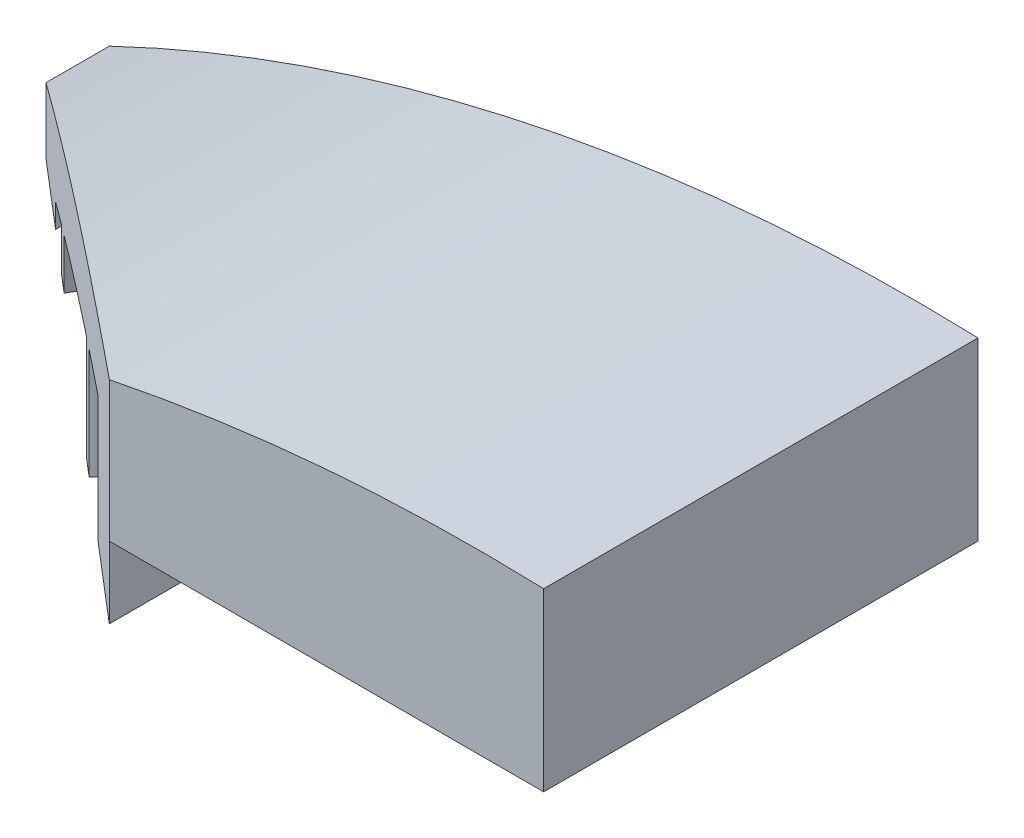
ISO-10303-21;
HEADER;
FILE_DESCRIPTION(('STEP AP214'),'2;1');
FILE_NAME('part.step','',(''),(''),'','','');
FILE_SCHEMA(('AUTOMOTIVE_DESIGN { 1 0 10303 214 1 1 1 1 }'));
ENDSEC;
DATA;
#1=APPLICATION_CONTEXT('core data for automotive mechanical design processes');
#2=APPLICATION_PROTOCOL_DEFINITION('international standard','automotive_design',2000,#1);
#3=PRODUCT_CONTEXT('',#1,'mechanical');
#4=PRODUCT('Part','Part','',(#3));
#5=PRODUCT_RELATED_PRODUCT_CATEGORY('part','',(#4));
#6=PRODUCT_DEFINITION_FORMATION('','',#4);
#7=PRODUCT_DEFINITION_CONTEXT('part definition',#1,'design');
#8=PRODUCT_DEFINITION('design','',#6,#7);
#9=PRODUCT_DEFINITION_SHAPE('','',#8);
#10=(LENGTH_UNIT() NAMED_UNIT(*) SI_UNIT(.MILLI.,.METRE.));
#11=(NAMED_UNIT(*) PLANE_ANGLE_UNIT() SI_UNIT($,.RADIAN.));
#12=(NAMED_UNIT(*) SI_UNIT($,.STERADIAN.) SOLID_ANGLE_UNIT());
#13=UNCERTAINTY_MEASURE_WITH_UNIT(LENGTH_MEASURE(1.E-05),#10,'distance_accuracy_value','');
#14=(GEOMETRIC_REPRESENTATION_CONTEXT(3) GLOBAL_UNCERTAINTY_ASSIGNED_CONTEXT((#13)) GLOBAL_UNIT_ASSIGNED_CONTEXT((#10,
#11,#12)) REPRESENTATION_CONTEXT('',''));
#15=CARTESIAN_POINT('',(0.,0.,0.));
#16=DIRECTION('',(0.,0.,1.));
#17=DIRECTION('',(1.,0.,0.));
#18=AXIS2_PLACEMENT_3D('',#15,#16,#17);
#19=CARTESIAN_POINT('',(-7.9,1.03720809548521,3.95));
#20=DIRECTION('',(0.,1.,0.));
#21=DIRECTION('',(0.,0.,1.));
#22=AXIS2_PLACEMENT_3D('',#19,#20,#21);
#23=PLANE('',#22);
#24=DIRECTION('',(0.,0.,-1.));
#25=VECTOR('',#24,1.);
#26=CARTESIAN_POINT('',(0.,1.03720809548521,3.95));
#27=LINE('',#26,#25);
#28=CARTESIAN_POINT('',(0.,1.03720809548521,3.95));
#29=VERTEX_POINT('',#28);
#30=CARTESIAN_POINT('',(0.,1.03720809548521,-3.95));
#31=VERTEX_POINT('',#30);
#32=EDGE_CURVE('E260',#29,#31,#27,.T.);
#33=ORIENTED_EDGE('',*,*,#32,.F.);
#34=DIRECTION('',(-0.760337182849053,0.,-0.649528573949727));
#35=VECTOR('',#34,1.);
#36=CARTESIAN_POINT('',(-4.5670897898204,1.03720809548521,0.0485002638345054));
#37=LINE('',#36,#35);
#38=CARTESIAN_POINT('',(-1.40471821566003,1.03720809548521,2.75));
#39=VERTEX_POINT('',#38);
#40=EDGE_CURVE('E224',#29,#39,#37,.T.);
#41=ORIENTED_EDGE('',*,*,#40,.T.);
#42=DIRECTION('',(1.,0.,0.));
#43=VECTOR('',#42,1.);
#44=CARTESIAN_POINT('',(6.73873493519161,1.03720809548521,2.75));
#45=LINE('',#44,#43);
#46=CARTESIAN_POINT('',(-1.2,1.03720809548521,2.75));
#47=VERTEX_POINT('',#46);
#48=EDGE_CURVE('E314',#39,#47,#45,.T.);
#49=ORIENTED_EDGE('',*,*,#48,.T.);
#50=DIRECTION('',(0.,0.,-1.));
#51=VECTOR('',#50,1.);
#52=CARTESIAN_POINT('',(-1.2,1.03720809548521,3.95));
#53=LINE('',#52,#51);
#54=CARTESIAN_POINT('',(-1.2,1.03720809548521,-2.75));
#55=VERTEX_POINT('',#54);
#56=EDGE_CURVE('E309',#47,#55,#53,.T.);
#57=ORIENTED_EDGE('',*,*,#56,.T.);
#58=DIRECTION('',(1.,0.,0.));
#59=VECTOR('',#58,1.);
#60=CARTESIAN_POINT('',(6.73873493519161,1.03720809548521,-2.75));
#61=LINE('',#60,#59);
#62=CARTESIAN_POINT('',(-6.7,1.03720809548521,-2.75));
#63=VERTEX_POINT('',#62);
#64=EDGE_CURVE('E306',#63,#55,#61,.T.);
#65=ORIENTED_EDGE('',*,*,#64,.F.);
#66=DIRECTION('',(0.,0.,-1.));
#67=VECTOR('',#66,1.);
#68=CARTESIAN_POINT('',(-6.7,1.03720809548521,3.95));
#69=LINE('',#68,#67);
#70=CARTESIAN_POINT('',(-6.7,1.03720809548521,-1.77356783756967));
#71=VERTEX_POINT('',#70);
#72=EDGE_CURVE('E330',#71,#63,#69,.T.);
#73=ORIENTED_EDGE('',*,*,#72,.F.);
#74=CARTESIAN_POINT('',(-7.9,1.03720809548521,-2.79868446519408));
#75=VERTEX_POINT('',#74);
#76=EDGE_CURVE('E374',#71,#75,#37,.T.);
#77=ORIENTED_EDGE('',*,*,#76,.T.);
#78=DIRECTION('',(0.,0.,-1.));
#79=VECTOR('',#78,1.);
#80=CARTESIAN_POINT('',(-7.9,1.03720809548521,3.95));
#81=LINE('',#80,#79);
#82=CARTESIAN_POINT('',(-7.9,1.03720809548521,-3.95));
#83=VERTEX_POINT('',#82);
#84=EDGE_CURVE('E263',#75,#83,#81,.T.);
#85=ORIENTED_EDGE('',*,*,#84,.T.);
#86=DIRECTION('',(1.,0.,0.));
#87=VECTOR('',#86,1.);
#88=CARTESIAN_POINT('',(-7.9,1.03720809548521,-3.95));
#89=LINE('',#88,#87);
#90=EDGE_CURVE('E240',#83,#31,#89,.T.);
#91=ORIENTED_EDGE('',*,*,#90,.T.);
#92=EDGE_LOOP('',(#33,#41,#49,#57,#65,#73,#77,#85,#91));
#93=FACE_BOUND('',#92,.T.);
#94=ADVANCED_FACE('F53',(#93),#23,.F.);
#95=CARTESIAN_POINT('',(-7.9,1.03720809548521,3.95));
#96=DIRECTION('',(1.,0.,0.));
#97=DIRECTION('',(0.,0.,-1.));
#98=AXIS2_PLACEMENT_3D('',#95,#96,#97);
#99=PLANE('',#98);
#100=ORIENTED_EDGE('',*,*,#84,.F.);
#101=DIRECTION('',(0.,-1.,0.));
#102=VECTOR('',#101,1.);
#103=CARTESIAN_POINT('',(-7.9,5.56078833662162,-2.79868446519408));
#104=LINE('',#103,#102);
#105=CARTESIAN_POINT('',(-7.9,2.23720809548521,-2.79868446519408));
#106=VERTEX_POINT('',#105);
#107=EDGE_CURVE('E213',#106,#75,#104,.T.);
#108=ORIENTED_EDGE('',*,*,#107,.F.);
#109=DIRECTION('',(0.,0.,-1.));
#110=VECTOR('',#109,1.);
#111=CARTESIAN_POINT('',(-7.9,2.23720809548521,3.95));
#112=LINE('',#111,#110);
#113=CARTESIAN_POINT('',(-7.9,2.23720809548521,-3.95));
#114=VERTEX_POINT('',#113);
#115=EDGE_CURVE('E222',#106,#114,#112,.T.);
#116=ORIENTED_EDGE('',*,*,#115,.T.);
#117=DIRECTION('',(0.,-1.,0.));
#118=VECTOR('',#117,1.);
#119=CARTESIAN_POINT('',(-7.9,1.03720809548521,-3.95));
#120=LINE('',#119,#118);
#121=EDGE_CURVE('E237',#114,#83,#120,.T.);
#122=ORIENTED_EDGE('',*,*,#121,.T.);
#123=EDGE_LOOP('',(#100,#108,#116,#122));
#124=FACE_BOUND('',#123,.T.);
#125=ADVANCED_FACE('F55',(#124),#99,.F.);
#126=CARTESIAN_POINT('',(0.,1.03720809548521,3.95));
#127=DIRECTION('',(-1.,0.,0.));
#128=DIRECTION('',(0.,0.,1.));
#129=AXIS2_PLACEMENT_3D('',#126,#127,#128);
#130=PLANE('',#129);
#131=DIRECTION('',(0.,1.,0.));
#132=VECTOR('',#131,1.);
#133=CARTESIAN_POINT('',(0.,1.03720809548521,-3.95));
#134=LINE('',#133,#132);
#135=CARTESIAN_POINT('',(0.,2.34089257913856,-3.95));
#136=VERTEX_POINT('',#135);
#137=EDGE_CURVE('E243',#31,#136,#134,.T.);
#138=ORIENTED_EDGE('',*,*,#137,.T.);
#139=DIRECTION('',(0.,0.,-1.));
#140=VECTOR('',#139,1.);
#141=CARTESIAN_POINT('',(0.,2.34089257913856,3.95));
#142=LINE('',#141,#140);
#143=CARTESIAN_POINT('',(0.,2.34089257913856,-2.76982131033317));
#144=VERTEX_POINT('',#143);
#145=EDGE_CURVE('E256',#144,#136,#142,.T.);
#146=ORIENTED_EDGE('',*,*,#145,.F.);
#147=DIRECTION('',(0.,-1.,0.));
#148=VECTOR('',#147,1.);
#149=CARTESIAN_POINT('',(0.,4.74089257913856,-2.76982131033317));
#150=LINE('',#149,#148);
#151=CARTESIAN_POINT('',(0.,4.74089257913856,-2.76982131033317));
#152=VERTEX_POINT('',#151);
#153=EDGE_CURVE('E75',#152,#144,#150,.T.);
#154=ORIENTED_EDGE('',*,*,#153,.F.);
#155=DIRECTION('',(0.,0.,-1.));
#156=VECTOR('',#155,1.);
#157=CARTESIAN_POINT('',(0.,4.74089257913856,2.81210865858254));
#158=LINE('',#157,#156);
#159=CARTESIAN_POINT('',(0.,4.74089257913856,2.81210865858254));
#160=VERTEX_POINT('',#159);
#161=EDGE_CURVE('E389',#160,#152,#158,.T.);
#162=ORIENTED_EDGE('',*,*,#161,.F.);
#163=DIRECTION('',(0.,-1.,0.));
#164=VECTOR('',#163,1.);
#165=CARTESIAN_POINT('',(0.,4.74089257913856,2.81210865858254));
#166=LINE('',#165,#164);
#167=CARTESIAN_POINT('',(0.,2.34089257913856,2.81210865858254));
#168=VERTEX_POINT('',#167);
#169=EDGE_CURVE('E408',#160,#168,#166,.T.);
#170=ORIENTED_EDGE('',*,*,#169,.T.);
#171=CARTESIAN_POINT('',(0.,2.34089257913856,3.95));
#172=VERTEX_POINT('',#171);
#173=EDGE_CURVE('E257',#172,#168,#142,.T.);
#174=ORIENTED_EDGE('',*,*,#173,.F.);
#175=DIRECTION('',(0.,1.,0.));
#176=VECTOR('',#175,1.);
#177=CARTESIAN_POINT('',(0.,1.03720809548521,3.95));
#178=LINE('',#177,#176);
#179=EDGE_CURVE('E209',#29,#172,#178,.T.);
#180=ORIENTED_EDGE('',*,*,#179,.F.);
#181=ORIENTED_EDGE('',*,*,#32,.T.);
#182=EDGE_LOOP('',(#138,#146,#154,#162,#170,#174,#180,#181));
#183=FACE_BOUND('',#182,.T.);
#184=DIRECTION('',(0.,0.,1.));
#185=VECTOR('',#184,1.);
#186=CARTESIAN_POINT('',(0.,3.54089257913856,3.95));
#187=LINE('',#186,#185);
#188=CARTESIAN_POINT('',(0.,3.54089257913856,-2.75));
#189=VERTEX_POINT('',#188);
#190=CARTESIAN_POINT('',(0.,3.54089257913856,2.75));
#191=VERTEX_POINT('',#190);
#192=EDGE_CURVE('E417',#189,#191,#187,.T.);
#193=ORIENTED_EDGE('',*,*,#192,.T.);
#194=DIRECTION('',(0.,1.,0.));
#195=VECTOR('',#194,1.);
#196=CARTESIAN_POINT('',(0.,-28.339212531873,2.75));
#197=LINE('',#196,#195);
#198=CARTESIAN_POINT('',(0.,3.65890472950313,2.75));
#199=VERTEX_POINT('',#198);
#200=EDGE_CURVE('E273',#191,#199,#197,.T.);
#201=ORIENTED_EDGE('',*,*,#200,.T.);
#202=DIRECTION('',(0.,0.,-1.));
#203=VECTOR('',#202,1.);
#204=CARTESIAN_POINT('',(0.,3.65890472950313,3.95));
#205=LINE('',#204,#203);
#206=CARTESIAN_POINT('',(0.,3.65890472950313,-2.75));
#207=VERTEX_POINT('',#206);
#208=EDGE_CURVE('E410',#199,#207,#205,.T.);
#209=ORIENTED_EDGE('',*,*,#208,.T.);
#210=DIRECTION('',(0.,1.,0.));
#211=VECTOR('',#210,1.);
#212=CARTESIAN_POINT('',(0.,-28.339212531873,-2.75));
#213=LINE('',#212,#211);
#214=EDGE_CURVE('E419',#189,#207,#213,.T.);
#215=ORIENTED_EDGE('',*,*,#214,.F.);
#216=EDGE_LOOP('',(#193,#201,#209,#215));
#217=FACE_BOUND('',#216,.T.);
#218=ADVANCED_FACE('F453',(#183,#217),#130,.F.);
#219=CARTESIAN_POINT('',(0.,2.34089257913856,3.95));
#220=DIRECTION('',(0.,1.,0.));
#221=DIRECTION('',(0.,0.,1.));
#222=AXIS2_PLACEMENT_3D('',#219,#220,#221);
#223=PLANE('',#222);
#224=ORIENTED_EDGE('',*,*,#173,.T.);
#225=DIRECTION('',(-1.,0.,0.));
#226=VECTOR('',#225,1.);
#227=CARTESIAN_POINT('',(0.,2.34089257913856,2.81210865858254));
#228=LINE('',#227,#226);
#229=CARTESIAN_POINT('',(6.82392747067494,2.34089257913856,2.81210865858254));
#230=VERTEX_POINT('',#229);
#231=EDGE_CURVE('E393',#230,#168,#228,.T.);
#232=ORIENTED_EDGE('',*,*,#231,.F.);
#233=DIRECTION('',(0.,0.,1.));
#234=VECTOR('',#233,1.);
#235=CARTESIAN_POINT('',(6.82392747067494,2.34089257913856,2.81210865858254));
#236=LINE('',#235,#234);
#237=CARTESIAN_POINT('',(6.82392747067494,2.34089257913856,-2.76982131033317));
#238=VERTEX_POINT('',#237);
#239=EDGE_CURVE('E403',#238,#230,#236,.T.);
#240=ORIENTED_EDGE('',*,*,#239,.F.);
#241=DIRECTION('',(1.,0.,0.));
#242=VECTOR('',#241,1.);
#243=CARTESIAN_POINT('',(6.82392747067494,2.34089257913856,-2.76982131033317));
#244=LINE('',#243,#242);
#245=EDGE_CURVE('E388',#144,#238,#244,.T.);
#246=ORIENTED_EDGE('',*,*,#245,.F.);
#247=ORIENTED_EDGE('',*,*,#145,.T.);
#248=DIRECTION('',(1.,0.,0.));
#249=VECTOR('',#248,1.);
#250=CARTESIAN_POINT('',(0.,2.34089257913856,-3.95));
#251=LINE('',#250,#249);
#252=CARTESIAN_POINT('',(7.9,2.34089257913856,-3.95));
#253=VERTEX_POINT('',#252);
#254=EDGE_CURVE('E246',#136,#253,#251,.T.);
#255=ORIENTED_EDGE('',*,*,#254,.T.);
#256=DIRECTION('',(0.,0.,-1.));
#257=VECTOR('',#256,1.);
#258=CARTESIAN_POINT('',(7.9,2.34089257913856,3.95));
#259=LINE('',#258,#257);
#260=CARTESIAN_POINT('',(7.9,2.34089257913856,3.95));
#261=VERTEX_POINT('',#260);
#262=EDGE_CURVE('E253',#261,#253,#259,.T.);
#263=ORIENTED_EDGE('',*,*,#262,.F.);
#264=DIRECTION('',(1.,0.,0.));
#265=VECTOR('',#264,1.);
#266=CARTESIAN_POINT('',(0.,2.34089257913856,3.95));
#267=LINE('',#266,#265);
#268=EDGE_CURVE('E233',#172,#261,#267,.T.);
#269=ORIENTED_EDGE('',*,*,#268,.F.);
#270=EDGE_LOOP('',(#224,#232,#240,#246,#247,#255,#263,#269));
#271=FACE_BOUND('',#270,.T.);
#272=ADVANCED_FACE('F344',(#271),#223,.F.);
#273=CARTESIAN_POINT('',(7.9,2.34089257913856,3.95));
#274=DIRECTION('',(-1.,0.,0.));
#275=DIRECTION('',(0.,0.,1.));
#276=AXIS2_PLACEMENT_3D('',#273,#274,#275);
#277=PLANE('',#276);
#278=DIRECTION('',(0.,1.,0.));
#279=VECTOR('',#278,1.);
#280=CARTESIAN_POINT('',(7.9,2.34089257913856,-3.95));
#281=LINE('',#280,#279);
#282=CARTESIAN_POINT('',(7.9,5.54089257913856,-3.95));
#283=VERTEX_POINT('',#282);
#284=EDGE_CURVE('E248',#253,#283,#281,.T.);
#285=ORIENTED_EDGE('',*,*,#284,.T.);
#286=DIRECTION('',(0.,0.,-1.));
#287=VECTOR('',#286,1.);
#288=CARTESIAN_POINT('',(7.9,5.54089257913856,3.95));
#289=LINE('',#288,#287);
#290=CARTESIAN_POINT('',(7.9,5.54089257913856,3.95));
#291=VERTEX_POINT('',#290);
#292=EDGE_CURVE('E231',#291,#283,#289,.T.);
#293=ORIENTED_EDGE('',*,*,#292,.F.);
#294=DIRECTION('',(0.,1.,0.));
#295=VECTOR('',#294,1.);
#296=CARTESIAN_POINT('',(7.9,2.34089257913856,3.95));
#297=LINE('',#296,#295);
#298=EDGE_CURVE('E228',#261,#291,#297,.T.);
#299=ORIENTED_EDGE('',*,*,#298,.F.);
#300=ORIENTED_EDGE('',*,*,#262,.T.);
#301=EDGE_LOOP('',(#285,#293,#299,#300));
#302=FACE_BOUND('',#301,.T.);
#303=ADVANCED_FACE('F348',(#302),#277,.F.);
#304=CARTESIAN_POINT('',(6.73873493519161,-28.339212531873,3.95));
#305=DIRECTION('',(0.,0.,-1.));
#306=DIRECTION('',(-1.,0.,0.));
#307=AXIS2_PLACEMENT_3D('',#304,#305,#306);
#308=CYLINDRICAL_SURFACE('',#307,33.9000008684946);
#309=ORIENTED_EDGE('',*,*,#115,.F.);
#310=CARTESIAN_POINT('',(6.73873493519161,-28.339212531873,9.70665769268206));
#311=DIRECTION('',(0.649528573949726,0.,-0.760337182849053));
#312=DIRECTION('',(-0.760337182849053,0.,-0.649528573949727));
#313=AXIS2_PLACEMENT_3D('',#310,#311,#312);
#314=ELLIPSE('',#313,44.5854834317956,33.9000008684946);
#315=CARTESIAN_POINT('',(0.,4.88426576822622,3.95));
#316=VERTEX_POINT('',#315);
#317=EDGE_CURVE('E206',#106,#316,#314,.T.);
#318=ORIENTED_EDGE('',*,*,#317,.T.);
#319=CARTESIAN_POINT('',(6.73873493519161,-28.339212531873,3.95));
#320=DIRECTION('',(0.,0.,1.));
#321=DIRECTION('',(-1.,0.,0.));
#322=AXIS2_PLACEMENT_3D('',#319,#320,#321);
#323=CIRCLE('',#322,33.9000008684946);
#324=EDGE_CURVE('E220',#291,#316,#323,.T.);
#325=ORIENTED_EDGE('',*,*,#324,.F.);
#326=ORIENTED_EDGE('',*,*,#292,.T.);
#327=CARTESIAN_POINT('',(6.73873493519161,-28.339212531873,-3.95));
#328=DIRECTION('',(0.,0.,1.));
#329=DIRECTION('',(-1.,0.,0.));
#330=AXIS2_PLACEMENT_3D('',#327,#328,#329);
#331=CIRCLE('',#330,33.9000008684946);
#332=EDGE_CURVE('E250',#283,#114,#331,.T.);
#333=ORIENTED_EDGE('',*,*,#332,.T.);
#334=EDGE_LOOP('',(#309,#318,#325,#326,#333));
#335=FACE_BOUND('',#334,.T.);
#336=ADVANCED_FACE('F218',(#335),#308,.T.);
#337=CARTESIAN_POINT('',(6.73873493519161,-28.339212531873,3.95));
#338=DIRECTION('',(0.,0.,-1.));
#339=DIRECTION('',(-1.,0.,0.));
#340=AXIS2_PLACEMENT_3D('',#337,#338,#339);
#341=PLANE('',#340);
#342=ORIENTED_EDGE('',*,*,#324,.T.);
#343=DIRECTION('',(0.,-1.,0.));
#344=VECTOR('',#343,1.);
#345=CARTESIAN_POINT('',(0.,5.56078833662162,3.95));
#346=LINE('',#345,#344);
#347=EDGE_CURVE('E203',#316,#172,#346,.T.);
#348=ORIENTED_EDGE('',*,*,#347,.T.);
#349=ORIENTED_EDGE('',*,*,#268,.T.);
#350=ORIENTED_EDGE('',*,*,#298,.T.);
#351=EDGE_LOOP('',(#342,#348,#349,#350));
#352=FACE_BOUND('',#351,.T.);
#353=ADVANCED_FACE('F226',(#352),#341,.F.);
#354=CARTESIAN_POINT('',(6.73873493519161,-28.339212531873,-3.95));
#355=DIRECTION('',(0.,0.,-1.));
#356=DIRECTION('',(-1.,0.,0.));
#357=AXIS2_PLACEMENT_3D('',#354,#355,#356);
#358=PLANE('',#357);
#359=ORIENTED_EDGE('',*,*,#121,.F.);
#360=ORIENTED_EDGE('',*,*,#332,.F.);
#361=ORIENTED_EDGE('',*,*,#284,.F.);
#362=ORIENTED_EDGE('',*,*,#254,.F.);
#363=ORIENTED_EDGE('',*,*,#137,.F.);
#364=ORIENTED_EDGE('',*,*,#90,.F.);
#365=EDGE_LOOP('',(#359,#360,#361,#362,#363,#364));
#366=FACE_BOUND('',#365,.T.);
#367=ADVANCED_FACE('F352',(#366),#358,.T.);
#368=CARTESIAN_POINT('',(6.73873493519161,-28.339212531873,-2.75));
#369=DIRECTION('',(0.,0.,-1.));
#370=DIRECTION('',(-1.,0.,0.));
#371=AXIS2_PLACEMENT_3D('',#368,#369,#370);
#372=PLANE('',#371);
#373=DIRECTION('',(0.,-1.,0.));
#374=VECTOR('',#373,1.);
#375=CARTESIAN_POINT('',(-6.7,-28.339212531873,-2.75));
#376=LINE('',#375,#374);
#377=CARTESIAN_POINT('',(-6.7,1.47169923112427,-2.75));
#378=VERTEX_POINT('',#377);
#379=EDGE_CURVE('E300',#378,#63,#376,.T.);
#380=ORIENTED_EDGE('',*,*,#379,.T.);
#381=ORIENTED_EDGE('',*,*,#64,.T.);
#382=DIRECTION('',(0.,1.,0.));
#383=VECTOR('',#382,1.);
#384=CARTESIAN_POINT('',(-1.2,-28.339212531873,-2.75));
#385=LINE('',#384,#383);
#386=CARTESIAN_POINT('',(-1.2,3.38249209490134,-2.75));
#387=VERTEX_POINT('',#386);
#388=EDGE_CURVE('E321',#55,#387,#385,.T.);
#389=ORIENTED_EDGE('',*,*,#388,.T.);
#390=CARTESIAN_POINT('',(6.73873493519161,-28.339212531873,-2.75));
#391=DIRECTION('',(0.,0.,-1.));
#392=DIRECTION('',(-1.,0.,0.));
#393=AXIS2_PLACEMENT_3D('',#390,#391,#392);
#394=CIRCLE('',#393,32.7000008684946);
#395=EDGE_CURVE('E311',#387,#378,#394,.F.);
#396=ORIENTED_EDGE('',*,*,#395,.T.);
#397=EDGE_LOOP('',(#380,#381,#389,#396));
#398=FACE_BOUND('',#397,.T.);
#399=ADVANCED_FACE('F481',(#398),#372,.F.);
#400=CARTESIAN_POINT('',(-1.2,1.03720809548521,3.95));
#401=DIRECTION('',(-1.,0.,0.));
#402=DIRECTION('',(0.,0.,1.));
#403=AXIS2_PLACEMENT_3D('',#400,#401,#402);
#404=PLANE('',#403);
#405=ORIENTED_EDGE('',*,*,#388,.F.);
#406=ORIENTED_EDGE('',*,*,#56,.F.);
#407=DIRECTION('',(0.,1.,0.));
#408=VECTOR('',#407,1.);
#409=CARTESIAN_POINT('',(-1.2,-28.339212531873,2.75));
#410=LINE('',#409,#408);
#411=CARTESIAN_POINT('',(-1.2,3.38249209490134,2.75));
#412=VERTEX_POINT('',#411);
#413=EDGE_CURVE('E325',#47,#412,#410,.T.);
#414=ORIENTED_EDGE('',*,*,#413,.T.);
#415=DIRECTION('',(0.,0.,-1.));
#416=VECTOR('',#415,1.);
#417=CARTESIAN_POINT('',(-1.2,3.38249209490134,3.95));
#418=LINE('',#417,#416);
#419=EDGE_CURVE('E241',#387,#412,#418,.F.);
#420=ORIENTED_EDGE('',*,*,#419,.F.);
#421=EDGE_LOOP('',(#405,#406,#414,#420));
#422=FACE_BOUND('',#421,.T.);
#423=ADVANCED_FACE('F446',(#422),#404,.T.);
#424=CARTESIAN_POINT('',(-6.7,1.03720809548521,3.95));
#425=DIRECTION('',(1.,0.,0.));
#426=DIRECTION('',(0.,0.,-1.));
#427=AXIS2_PLACEMENT_3D('',#424,#425,#426);
#428=PLANE('',#427);
#429=DIRECTION('',(0.,1.,0.));
#430=VECTOR('',#429,1.);
#431=CARTESIAN_POINT('',(-6.7,1.03720809548521,-1.77356783756967));
#432=LINE('',#431,#430);
#433=CARTESIAN_POINT('',(-6.7,1.47169923112427,-1.77356783756967));
#434=VERTEX_POINT('',#433);
#435=EDGE_CURVE('E371',#71,#434,#432,.T.);
#436=ORIENTED_EDGE('',*,*,#435,.F.);
#437=ORIENTED_EDGE('',*,*,#72,.T.);
#438=ORIENTED_EDGE('',*,*,#379,.F.);
#439=DIRECTION('',(0.,0.,-1.));
#440=VECTOR('',#439,1.);
#441=CARTESIAN_POINT('',(-6.7,1.47169923112427,2.75));
#442=LINE('',#441,#440);
#443=EDGE_CURVE('E307',#434,#378,#442,.T.);
#444=ORIENTED_EDGE('',*,*,#443,.F.);
#445=EDGE_LOOP('',(#436,#437,#438,#444));
#446=FACE_BOUND('',#445,.T.);
#447=ADVANCED_FACE('F290',(#446),#428,.T.);
#448=CARTESIAN_POINT('',(6.73873493519161,-28.339212531873,2.75));
#449=DIRECTION('',(0.,0.,-1.));
#450=DIRECTION('',(-1.,0.,0.));
#451=AXIS2_PLACEMENT_3D('',#448,#449,#450);
#452=PLANE('',#451);
#453=DIRECTION('',(0.,-1.,0.));
#454=VECTOR('',#453,1.);
#455=CARTESIAN_POINT('',(-1.40471821566003,-28.339212531873,2.75));
#456=LINE('',#455,#454);
#457=CARTESIAN_POINT('',(-1.40471821566003,3.33055582186513,2.75));
#458=VERTEX_POINT('',#457);
#459=EDGE_CURVE('E378',#458,#39,#456,.T.);
#460=ORIENTED_EDGE('',*,*,#459,.F.);
#461=CARTESIAN_POINT('',(6.73873493519161,-28.339212531873,2.75));
#462=DIRECTION('',(0.,0.,-1.));
#463=DIRECTION('',(-1.,0.,0.));
#464=AXIS2_PLACEMENT_3D('',#461,#462,#463);
#465=CIRCLE('',#464,32.7000008684946);
#466=EDGE_CURVE('E317',#412,#458,#465,.F.);
#467=ORIENTED_EDGE('',*,*,#466,.F.);
#468=ORIENTED_EDGE('',*,*,#413,.F.);
#469=ORIENTED_EDGE('',*,*,#48,.F.);
#470=EDGE_LOOP('',(#460,#467,#468,#469));
#471=FACE_BOUND('',#470,.T.);
#472=ADVANCED_FACE('F442',(#471),#452,.T.);
#473=CARTESIAN_POINT('',(6.73873493519161,-28.339212531873,3.95));
#474=DIRECTION('',(0.,0.,-1.));
#475=DIRECTION('',(-1.,0.,0.));
#476=AXIS2_PLACEMENT_3D('',#473,#474,#475);
#477=CYLINDRICAL_SURFACE('',#476,32.7000008684946);
#478=CARTESIAN_POINT('',(6.73873493519161,-28.339212531873,9.70665769268206));
#479=DIRECTION('',(0.649528573949726,0.,-0.760337182849053));
#480=DIRECTION('',(-0.760337182849053,0.,-0.649528573949727));
#481=AXIS2_PLACEMENT_3D('',#478,#479,#480);
#482=ELLIPSE('',#481,43.0072362711037,32.7000008684946);
#483=CARTESIAN_POINT('',(-5.9511125434821,1.79810366860423,-1.13382035098979));
#484=VERTEX_POINT('',#483);
#485=EDGE_CURVE('E369',#434,#484,#482,.T.);
#486=ORIENTED_EDGE('',*,*,#485,.F.);
#487=ORIENTED_EDGE('',*,*,#443,.T.);
#488=ORIENTED_EDGE('',*,*,#395,.F.);
#489=ORIENTED_EDGE('',*,*,#419,.T.);
#490=ORIENTED_EDGE('',*,*,#466,.T.);
#491=CARTESIAN_POINT('',(-2.51747698250379,3.02338617636963,1.79941040464468));
#492=VERTEX_POINT('',#491);
#493=EDGE_CURVE('E372',#492,#458,#482,.T.);
#494=ORIENTED_EDGE('',*,*,#493,.F.);
#495=CARTESIAN_POINT('',(-3.95,2.5645251431197,-2.3));
#496=CARTESIAN_POINT('',(-3.81734466530422,2.61040566286812,-2.29999526779321));
#497=CARTESIAN_POINT('',(-3.68430818236294,2.65545455104332,-2.28849682468852));
#498=CARTESIAN_POINT('',(-3.42121457431844,2.74269118119623,-2.24237571212869));
#499=CARTESIAN_POINT('',(-3.29116037461759,2.78487618727391,-2.20773126416591));
#500=CARTESIAN_POINT('',(-3.03782698311466,2.86537978186146,-2.11568396989945));
#501=CARTESIAN_POINT('',(-2.91455749737173,2.90369289360183,-2.05824943722508));
#502=CARTESIAN_POINT('',(-2.67907306149248,2.97548234515793,-1.92178322697199));
#503=CARTESIAN_POINT('',(-2.56685416827005,3.00896041222455,-1.84275929121778));
#504=CARTESIAN_POINT('',(-2.36111025702631,3.06928929471363,-1.66822743448446));
#505=CARTESIAN_POINT('',(-2.26706566514477,3.09633214343632,-1.57339887611113));
#506=CARTESIAN_POINT('',(-2.09626174377039,3.14476424415758,-1.36802033720454));
#507=CARTESIAN_POINT('',(-2.01949875727989,3.16615469243955,-1.25747369090326));
#508=CARTESIAN_POINT('',(-1.88894604319519,3.2021505719059,-1.02890316508524));
#509=CARTESIAN_POINT('',(-1.8343188606679,3.21700565269074,-0.911396480875684));
#510=CARTESIAN_POINT('',(-1.74545502259763,3.24101408967483,-0.668364989512966));
#511=CARTESIAN_POINT('',(-1.71121470755376,3.25016846917977,-0.542841625858508));
#512=CARTESIAN_POINT('',(-1.66500371009565,3.2624930104205,-0.291072460946157));
#513=CARTESIAN_POINT('',(-1.65244506820639,3.26582120196001,-0.16494199269272));
#514=CARTESIAN_POINT('',(-1.64820367015749,3.26694707205889,0.087689337648819));
#515=CARTESIAN_POINT('',(-1.65651915449635,3.26474521675156,0.214190167620999));
#516=CARTESIAN_POINT('',(-1.69354711998094,3.25488550217497,0.462644111942685));
#517=CARTESIAN_POINT('',(-1.72205441517336,3.24728252595566,0.584630091042373));
#518=CARTESIAN_POINT('',(-1.79827771661635,3.22676626779136,0.821964862798165));
#519=CARTESIAN_POINT('',(-1.84599373912943,3.21385298135054,0.937313649834992));
#520=CARTESIAN_POINT('',(-1.95944179376861,3.18276779671223,1.15900277117734));
#521=CARTESIAN_POINT('',(-2.02529378794818,3.16456083669969,1.26527672155124));
#522=CARTESIAN_POINT('',(-2.17273036803262,3.12317277338226,1.46517651025352));
#523=CARTESIAN_POINT('',(-2.2543162350607,3.09999126500976,1.55880131757496));
#524=CARTESIAN_POINT('',(-2.43273476201788,3.04841243418614,1.73315354322187));
#525=CARTESIAN_POINT('',(-2.52987683380352,3.01990672689725,1.81353195242528));
#526=CARTESIAN_POINT('',(-2.73500134399116,2.95854825331941,1.95689680103408));
#527=CARTESIAN_POINT('',(-2.84298553349322,2.92569478455427,2.01988042484332));
#528=CARTESIAN_POINT('',(-3.07094963203474,2.85493598861204,2.12928435598579));
#529=CARTESIAN_POINT('',(-3.1912289836862,2.81688644456804,2.17498692224653));
#530=CARTESIAN_POINT('',(-3.43671738628111,2.73757742514658,2.2456328948404));
#531=CARTESIAN_POINT('',(-3.56192752836079,2.6963172372907,2.27057167900621));
#532=CARTESIAN_POINT('',(-3.81966642348853,2.60960828852752,2.30012712114954));
#533=CARTESIAN_POINT('',(-3.95227081069821,2.56405457541874,2.30377791058369));
#534=CARTESIAN_POINT('',(-4.21571278464031,2.47165627368456,2.28840945464247));
#535=CARTESIAN_POINT('',(-4.346549954446,2.4248113881031,2.26938495096501));
#536=CARTESIAN_POINT('',(-4.60752885208002,2.32953878300992,2.20821914616576));
#537=CARTESIAN_POINT('',(-4.73748958722681,2.28111242888584,2.16530011459196));
#538=CARTESIAN_POINT('',(-4.98830269781574,2.18593537780509,2.05684182197678));
#539=CARTESIAN_POINT('',(-5.1091539525073,2.13918488740185,1.99129978311538));
#540=CARTESIAN_POINT('',(-5.33807270544182,2.04920467893997,1.83905742850756));
#541=CARTESIAN_POINT('',(-5.44615026840916,2.00597219743123,1.75237393789866));
#542=CARTESIAN_POINT('',(-5.64600232011629,1.92495745752696,1.5597495290404));
#543=CARTESIAN_POINT('',(-5.73778116338077,1.8871737438941,1.45381376976493));
#544=CARTESIAN_POINT('',(-5.89726274701204,1.82083920793938,1.2312370997009));
#545=CARTESIAN_POINT('',(-5.96595512888681,1.79191560922513,1.11541838814946));
#546=CARTESIAN_POINT('',(-6.08251555149458,1.74250335742256,0.872090366610948));
#547=CARTESIAN_POINT('',(-6.13039642393467,1.72200950724201,0.744588319085629));
#548=CARTESIAN_POINT('',(-6.20016863078913,1.69204057485589,0.492427267406552));
#549=CARTESIAN_POINT('',(-6.22381658105418,1.68182195478728,0.368341534532106));
#550=CARTESIAN_POINT('',(-6.25044642631608,1.67031009992635,0.117578162354728));
#551=CARTESIAN_POINT('',(-6.25343605330197,1.66901352579496,-0.00909848941346012));
#552=CARTESIAN_POINT('',(-6.23902476216924,1.67524819879018,-0.254240802459827));
#553=CARTESIAN_POINT('',(-6.22270316220718,1.68231217557626,-0.372783972333058));
#554=CARTESIAN_POINT('',(-6.17212534762513,1.70409776224182,-0.605232728592966));
#555=CARTESIAN_POINT('',(-6.13786909628965,1.71881938779788,-0.719138305485132));
#556=CARTESIAN_POINT('',(-6.05238885309041,1.75529477705703,-0.940285628515714));
#557=CARTESIAN_POINT('',(-6.00102477203304,1.77710656256465,-1.0474633731791));
#558=CARTESIAN_POINT('',(-5.88320745275709,1.82667382475136,-1.25164375407804));
#559=CARTESIAN_POINT('',(-5.81675128511229,1.85443045528583,-1.34864440955426));
#560=CARTESIAN_POINT('',(-5.66636451668288,1.91653993420371,-1.53602720275662));
#561=CARTESIAN_POINT('',(-5.58162260425883,1.95118934922871,-1.62565900327171));
#562=CARTESIAN_POINT('',(-5.3999075354469,2.0244666178986,-1.78962605252447));
#563=CARTESIAN_POINT('',(-5.3029275179148,2.06309670101064,-1.86395265859089));
#564=CARTESIAN_POINT('',(-5.09154289793304,2.14600372268749,-2.0009795813078));
#565=CARTESIAN_POINT('',(-4.97637557348464,2.19048679930008,-2.06237862852837));
#566=CARTESIAN_POINT('',(-4.73792522732795,2.28092051932343,-2.16471406321071));
#567=CARTESIAN_POINT('',(-4.61464851138408,2.32687000848325,-2.20566614201349));
#568=CARTESIAN_POINT('',(-4.40082229136112,2.40504140759443,-2.25720514030176));
#569=CARTESIAN_POINT('',(-4.31153625807521,2.43725059101107,-2.27321405004376));
#570=CARTESIAN_POINT('',(-4.1315597997024,2.50127831562224,-2.29461329697436));
#571=CARTESIAN_POINT('',(-4.04086932281772,2.53309684233085,-2.30000324157658));
#572=CARTESIAN_POINT('',(-3.95,2.5645251431197,-2.3));
#573=B_SPLINE_CURVE_WITH_KNOTS('',3,(#495,#496,#497,#498,#499,#500,#501,#502,#503,#504,#505,
#506,#507,#508,#509,#510,#511,#512,#513,#514,#515,#516,#517,#518,#519,#520,#521,#522,#523,#524,
#525,#526,#527,#528,#529,#530,#531,#532,#533,#534,#535,#536,#537,#538,#539,#540,#541,#542,#543,
#544,#545,#546,#547,#548,#549,#550,#551,#552,#553,#554,#555,#556,#557,#558,#559,#560,#561,#562,
#563,#564,#565,#566,#567,#568,#569,#570,#571,#572),.UNSPECIFIED.,.T.,.F.,(4,2,2,2,2,2,2,2,2,2,2,
2,2,2,2,2,2,2,2,2,2,2,2,2,2,2,2,2,2,2,2,2,2,2,2,2,2,2,4),(0.,0.42076213709448,0.841920735747958,
1.26366695888243,1.68526214452463,2.09199399821281,2.49863970142803,2.88800927655997,
3.27730893765424,3.65587537913358,4.03440991193108,4.4091520226446,4.78389445062312,
5.1611777819429,5.5384918463613,5.92454640031315,6.31066340617141,6.71140557941147,
7.11223693690993,7.53112119034528,7.95010260012364,8.38359354068829,8.81713772741991,
9.25033800334235,9.68342236656571,10.0944053843525,10.505134642533,10.8833657383968,
11.2614552624043,11.619373866299,11.9772932029212,12.3382185662001,12.6992140463103,
13.0819487176339,13.4648989258005,13.8767585954564,14.2883017095282,14.576514445905,
14.8647378373939),.UNSPECIFIED.);
#574=EDGE_CURVE('E265',#484,#492,#573,.T.);
#575=ORIENTED_EDGE('',*,*,#574,.F.);
#576=EDGE_LOOP('',(#486,#487,#488,#489,#490,#494,#575));
#577=FACE_BOUND('',#576,.T.);
#578=ADVANCED_FACE('F437',(#577),#477,.F.);
#579=CARTESIAN_POINT('',(-3.95,1.01720809548521,0.));
#580=DIRECTION('',(0.,-1.,0.));
#581=DIRECTION('',(0.,0.,-1.));
#582=AXIS2_PLACEMENT_3D('',#579,#580,#581);
#583=PLANE('',#582);
#584=DIRECTION('',(0.760337182849053,0.,0.649528573949727));
#585=VECTOR('',#584,1.);
#586=CARTESIAN_POINT('',(-7.9,1.01720809548521,-2.79868446519408));
#587=LINE('',#586,#585);
#588=CARTESIAN_POINT('',(-5.9511125434821,1.01720809548521,-1.13382035098979));
#589=VERTEX_POINT('',#588);
#590=CARTESIAN_POINT('',(-5.64008068918418,1.01720809548521,-0.868117079688408));
#591=VERTEX_POINT('',#590);
#592=EDGE_CURVE('E358',#589,#591,#587,.T.);
#593=ORIENTED_EDGE('',*,*,#592,.F.);
#594=CARTESIAN_POINT('',(-3.95,1.01720809548521,0.));
#595=DIRECTION('',(0.,-1.,0.));
#596=DIRECTION('',(0.,0.,-1.));
#597=AXIS2_PLACEMENT_3D('',#594,#595,#596);
#598=CIRCLE('',#597,2.3);
#599=CARTESIAN_POINT('',(-2.51747698250379,1.01720809548521,1.79941040464468));
#600=VERTEX_POINT('',#599);
#601=EDGE_CURVE('E302',#589,#600,#598,.T.);
#602=ORIENTED_EDGE('',*,*,#601,.T.);
#603=CARTESIAN_POINT('',(-2.82850883680171,1.01720809548521,1.53370713334331));
#604=VERTEX_POINT('',#603);
#605=EDGE_CURVE('E360',#604,#600,#587,.T.);
#606=ORIENTED_EDGE('',*,*,#605,.F.);
#607=CARTESIAN_POINT('',(-3.95,1.01720809548521,0.));
#608=DIRECTION('',(0.,-1.,0.));
#609=DIRECTION('',(0.,0.,-1.));
#610=AXIS2_PLACEMENT_3D('',#607,#608,#609);
#611=CIRCLE('',#610,1.9);
#612=EDGE_CURVE('E301',#591,#604,#611,.T.);
#613=ORIENTED_EDGE('',*,*,#612,.F.);
#614=EDGE_LOOP('',(#593,#602,#606,#613));
#615=FACE_BOUND('',#614,.T.);
#616=ADVANCED_FACE('F284',(#615),#583,.T.);
#617=CARTESIAN_POINT('',(-3.95,5.56278833662162,0.));
#618=DIRECTION('',(0.,-1.,0.));
#619=DIRECTION('',(0.,0.,-1.));
#620=AXIS2_PLACEMENT_3D('',#617,#618,#619);
#621=CYLINDRICAL_SURFACE('',#620,2.3);
#622=DIRECTION('',(0.,-1.,0.));
#623=VECTOR('',#622,1.);
#624=CARTESIAN_POINT('',(-2.51747698250379,5.56278833662162,1.79941040464468));
#625=LINE('',#624,#623);
#626=EDGE_CURVE('E376',#600,#492,#625,.F.);
#627=ORIENTED_EDGE('',*,*,#626,.F.);
#628=ORIENTED_EDGE('',*,*,#601,.F.);
#629=DIRECTION('',(0.,-1.,0.));
#630=VECTOR('',#629,1.);
#631=CARTESIAN_POINT('',(-5.9511125434821,5.56278833662162,-1.13382035098979));
#632=LINE('',#631,#630);
#633=EDGE_CURVE('E367',#484,#589,#632,.T.);
#634=ORIENTED_EDGE('',*,*,#633,.F.);
#635=ORIENTED_EDGE('',*,*,#574,.T.);
#636=EDGE_LOOP('',(#627,#628,#634,#635));
#637=FACE_BOUND('',#636,.T.);
#638=ADVANCED_FACE('F278',(#637),#621,.T.);
#639=CARTESIAN_POINT('',(-3.95,5.56278833662162,0.));
#640=DIRECTION('',(0.,-1.,0.));
#641=DIRECTION('',(0.,0.,-1.));
#642=AXIS2_PLACEMENT_3D('',#639,#640,#641);
#643=CYLINDRICAL_SURFACE('',#642,1.9);
#644=ORIENTED_EDGE('',*,*,#612,.T.);
#645=DIRECTION('',(0.,-1.,0.));
#646=VECTOR('',#645,1.);
#647=CARTESIAN_POINT('',(-2.82850883680171,5.56278833662162,1.53370713334331));
#648=LINE('',#647,#646);
#649=CARTESIAN_POINT('',(-2.82850883680171,2.92990807307531,1.5337071333433));
#650=VERTEX_POINT('',#649);
#651=EDGE_CURVE('E364',#604,#650,#648,.F.);
#652=ORIENTED_EDGE('',*,*,#651,.T.);
#653=CARTESIAN_POINT('',(-3.95,2.5645251431197,-1.9));
#654=CARTESIAN_POINT('',(-4.06287071417673,2.52548529967304,-1.89999563113273));
#655=CARTESIAN_POINT('',(-4.17561591795352,2.48579114494403,-1.88991667111359));
#656=CARTESIAN_POINT('',(-4.39763473922453,2.40627957903659,-1.84996750188102));
#657=CARTESIAN_POINT('',(-4.50690293998712,2.36646207233928,-1.82006785845709));
#658=CARTESIAN_POINT('',(-4.71881477891654,2.28802002217167,-1.74117806520784));
#659=CARTESIAN_POINT('',(-4.82145787127089,2.24939557712862,-1.69218634480737));
#660=CARTESIAN_POINT('',(-5.01703930002874,2.1747644771289,-1.57618155364684));
#661=CARTESIAN_POINT('',(-5.10998099930635,2.13875691638345,-1.50917475659408));
#662=CARTESIAN_POINT('',(-5.28149614173575,2.07151646505976,-1.3600666962275));
#663=CARTESIAN_POINT('',(-5.36031037717422,2.04020543104378,-1.27827861400229));
#664=CARTESIAN_POINT('',(-5.50281907165269,1.98306183734739,-1.1007682287844));
#665=CARTESIAN_POINT('',(-5.56651901437444,1.95722729108253,-1.00505099988265));
#666=CARTESIAN_POINT('',(-5.67256943070735,1.91393050424319,-0.808934264133765));
#667=CARTESIAN_POINT('',(-5.71602810472015,1.8960371990791,-0.709230016758318));
#668=CARTESIAN_POINT('',(-5.78544647766774,1.86734910369242,-0.502950188804995));
#669=CARTESIAN_POINT('',(-5.81141564451725,1.85655047285763,-0.396378360274264));
#670=CARTESIAN_POINT('',(-5.84345306305283,1.84321412489259,-0.187591210511434));
#671=CARTESIAN_POINT('',(-5.85080587216069,1.84014328019227,-0.0856054725120066));
#672=CARTESIAN_POINT('',(-5.84905443529282,1.84087393623304,0.118188391679132));
#673=CARTESIAN_POINT('',(-5.83995377905128,1.84467393792747,0.219996551763236));
#674=CARTESIAN_POINT('',(-5.80622541110387,1.85870691778147,0.417303011605799));
#675=CARTESIAN_POINT('',(-5.78208074256487,1.86873973992156,0.512899060871594));
#676=CARTESIAN_POINT('',(-5.71964922419473,1.89454101865312,0.698522107460912));
#677=CARTESIAN_POINT('',(-5.68136114799026,1.91030997262214,0.788548621060071));
#678=CARTESIAN_POINT('',(-5.59076834422964,1.94734973731311,0.963236121605449));
#679=CARTESIAN_POINT('',(-5.53810941388665,1.96875902893892,1.04768346145945));
#680=CARTESIAN_POINT('',(-5.42101399692676,2.01592772997307,1.20659335416298));
#681=CARTESIAN_POINT('',(-5.35657435497142,2.04168830468541,1.28105322268903));
#682=CARTESIAN_POINT('',(-5.21320507094708,2.09838752172557,1.4230766538802));
#683=CARTESIAN_POINT('',(-5.13360313397051,2.12955470739792,1.48986998654552));
#684=CARTESIAN_POINT('',(-4.9653621247853,2.19457700970529,1.60925114634727));
#685=CARTESIAN_POINT('',(-4.87672012068165,2.22843299758597,1.66183434451085));
#686=CARTESIAN_POINT('',(-4.68642648887118,2.30008811968632,1.7548878151856));
#687=CARTESIAN_POINT('',(-4.58430077854186,2.33799927248364,1.79430436148021));
#688=CARTESIAN_POINT('',(-4.37501642239964,2.41443772117902,1.85505819526463));
#689=CARTESIAN_POINT('',(-4.26785658462534,2.45296516156061,1.87639117799372));
#690=CARTESIAN_POINT('',(-4.04734004230091,2.53091536301711,1.90086007723942));
#691=CARTESIAN_POINT('',(-3.93389957942017,2.57031987565694,1.90330752363663));
#692=CARTESIAN_POINT('',(-3.7078156966704,2.64746048505941,1.88790455188213));
#693=CARTESIAN_POINT('',(-3.59517228915919,2.68519655600138,1.87005381971167));
#694=CARTESIAN_POINT('',(-3.37489528166366,2.75769871775651,1.81440359454977));
#695=CARTESIAN_POINT('',(-3.26723046690798,2.79248494441005,1.77675458382891));
#696=CARTESIAN_POINT('',(-3.05948548490832,2.85849277351418,1.68225933740036));
#697=CARTESIAN_POINT('',(-2.95940374633006,2.88971511514148,1.62541709223057));
#698=CARTESIAN_POINT('',(-2.77401358827773,2.94667449046911,1.49643164701631));
#699=CARTESIAN_POINT('',(-2.68828109695708,2.97257802185724,1.42497202868944));
#700=CARTESIAN_POINT('',(-2.53005873495311,3.01977899650631,1.26736872769449));
#701=CARTESIAN_POINT('',(-2.45756516857115,3.04107772552237,1.18122915601404));
#702=CARTESIAN_POINT('',(-2.3315429388221,3.07772934909735,1.00105832633894));
#703=CARTESIAN_POINT('',(-2.27728811650481,3.09331300922262,0.907581641667309));
#704=CARTESIAN_POINT('',(-2.18523296505211,3.11957254990495,0.712214237033965));
#705=CARTESIAN_POINT('',(-2.14742893795018,3.13024953346181,0.610325414165842));
#706=CARTESIAN_POINT('',(-2.09071059450802,3.14620933914281,0.404954120226854));
#707=CARTESIAN_POINT('',(-2.07117120664548,3.15167080748496,0.301657791082543));
#708=CARTESIAN_POINT('',(-2.04939100153302,3.15775608600177,0.0931206008007295));
#709=CARTESIAN_POINT('',(-2.04714805759514,3.15838049091866,-0.0121200196809292));
#710=CARTESIAN_POINT('',(-2.05992669904488,3.15481307534672,-0.219658297900217));
#711=CARTESIAN_POINT('',(-2.07465540776801,3.15070295801353,-0.32197557043467));
#712=CARTESIAN_POINT('',(-2.1203889981336,3.13786703416271,-0.522597721690432));
#713=CARTESIAN_POINT('',(-2.15139359854374,3.12914130739852,-0.620902669709354));
#714=CARTESIAN_POINT('',(-2.228738190953,3.10718778166715,-0.811063765118821));
#715=CARTESIAN_POINT('',(-2.27512162147377,3.09394722722429,-0.902900742116876));
#716=CARTESIAN_POINT('',(-2.38166529798649,3.06319851010191,-1.07739441628581));
#717=CARTESIAN_POINT('',(-2.44182597333348,3.04569021442109,-1.16005082723364));
#718=CARTESIAN_POINT('',(-2.57545513205484,3.00629533096993,-1.31582004265479));
#719=CARTESIAN_POINT('',(-2.6491826970885,2.98432244169296,-1.3886885063964));
#720=CARTESIAN_POINT('',(-2.80676742607207,2.93666011588082,-1.52105722194353));
#721=CARTESIAN_POINT('',(-2.89062864546461,2.91096919058613,-1.58055209427377));
#722=CARTESIAN_POINT('',(-3.06935658096049,2.85534594152045,-1.68691755133681));
#723=CARTESIAN_POINT('',(-3.16452019052482,2.82528965088707,-1.73322331537065));
#724=CARTESIAN_POINT('',(-3.36030123164305,2.76239621499921,-1.80921707204492));
#725=CARTESIAN_POINT('',(-3.46091353936866,2.72956166655237,-1.83892038951046));
#726=CARTESIAN_POINT('',(-3.62672589280608,2.67452360663496,-1.8734341305303));
#727=CARTESIAN_POINT('',(-3.69110562942862,2.65293379298661,-1.88339912589317));
#728=CARTESIAN_POINT('',(-3.82033736884099,2.60914294774485,-1.89668334099245));
#729=CARTESIAN_POINT('',(-3.88518937533025,2.58694191135974,-1.90000250861367));
#730=CARTESIAN_POINT('',(-3.95,2.5645251431197,-1.9));
#731=B_SPLINE_CURVE_WITH_KNOTS('',3,(#653,#654,#655,#656,#657,#658,#659,#660,#661,#662,#663,
#664,#665,#666,#667,#668,#669,#670,#671,#672,#673,#674,#675,#676,#677,#678,#679,#680,#681,#682,
#683,#684,#685,#686,#687,#688,#689,#690,#691,#692,#693,#694,#695,#696,#697,#698,#699,#700,#701,
#702,#703,#704,#705,#706,#707,#708,#709,#710,#711,#712,#713,#714,#715,#716,#717,#718,#719,#720,
#721,#722,#723,#724,#725,#726,#727,#728,#729,#730),.UNSPECIFIED.,.T.,.F.,(4,2,2,2,2,2,2,2,2,2,2,
2,2,2,2,2,2,2,2,2,2,2,2,2,2,2,2,2,2,2,2,2,2,2,2,2,2,2,4),(0.,0.358045319291095,
0.716623539528378,1.07523126378271,1.43371426515682,1.78534146919068,2.13684090209555,
2.46577106303335,2.79452301475132,3.09988281247234,3.40517599637022,3.70113871585715,
3.9971271042652,4.30119805862201,4.60535057478935,4.92940809779276,5.25357105612662,
5.5995562921057,5.94562386615522,6.30425029931537,6.6628822806068,7.01882696193787,
7.37469768298819,7.71668246000428,8.05857162418967,8.3845338328709,8.71042273076252,
9.02469973993008,9.33893810648435,9.64783391116043,9.95672437857924,10.2664948677914,
10.5762750120273,10.8927377759297,11.2093276088619,11.5379328445898,11.8662342594739,
12.0718230962676,12.2774135452392),.UNSPECIFIED.);
#732=CARTESIAN_POINT('',(-5.64008068918418,1.92718765938296,-0.868117079688406));
#733=VERTEX_POINT('',#732);
#734=EDGE_CURVE('E293',#650,#733,#731,.T.);
#735=ORIENTED_EDGE('',*,*,#734,.T.);
#736=DIRECTION('',(0.,-1.,0.));
#737=VECTOR('',#736,1.);
#738=CARTESIAN_POINT('',(-5.64008068918418,5.56278833662162,-0.868117079688407));
#739=LINE('',#738,#737);
#740=EDGE_CURVE('E67',#733,#591,#739,.T.);
#741=ORIENTED_EDGE('',*,*,#740,.T.);
#742=EDGE_LOOP('',(#644,#652,#735,#741));
#743=FACE_BOUND('',#742,.T.);
#744=ADVANCED_FACE('F283',(#743),#643,.F.);
#745=CARTESIAN_POINT('',(6.73873493519161,-28.339212531873,9.70665769268206));
#746=DIRECTION('',(0.649528573949726,0.,-0.760337182849053));
#747=DIRECTION('',(-0.760337182849053,0.,-0.649528573949727));
#748=AXIS2_PLACEMENT_3D('',#745,#746,#747);
#749=ELLIPSE('',#748,43.0072362711037,32.7000008684946);
#750=EDGE_CURVE('E12',#733,#650,#749,.T.);
#751=ORIENTED_EDGE('',*,*,#750,.F.);
#752=ORIENTED_EDGE('',*,*,#734,.F.);
#753=EDGE_LOOP('',(#751,#752));
#754=FACE_BOUND('',#753,.T.);
#755=ADVANCED_FACE('F518',(#754),#477,.F.);
#756=CARTESIAN_POINT('',(0.,4.74089257913856,2.81210865858254));
#757=DIRECTION('',(0.,0.,1.));
#758=DIRECTION('',(1.,0.,0.));
#759=AXIS2_PLACEMENT_3D('',#756,#757,#758);
#760=PLANE('',#759);
#761=ORIENTED_EDGE('',*,*,#231,.T.);
#762=ORIENTED_EDGE('',*,*,#169,.F.);
#763=DIRECTION('',(-1.,0.,0.));
#764=VECTOR('',#763,1.);
#765=CARTESIAN_POINT('',(0.,4.74089257913856,2.81210865858254));
#766=LINE('',#765,#764);
#767=CARTESIAN_POINT('',(6.82392747067494,4.74089257913856,2.81210865858254));
#768=VERTEX_POINT('',#767);
#769=EDGE_CURVE('E399',#768,#160,#766,.T.);
#770=ORIENTED_EDGE('',*,*,#769,.F.);
#771=DIRECTION('',(0.,-1.,0.));
#772=VECTOR('',#771,1.);
#773=CARTESIAN_POINT('',(6.82392747067494,4.74089257913856,2.81210865858254));
#774=LINE('',#773,#772);
#775=EDGE_CURVE('E411',#768,#230,#774,.T.);
#776=ORIENTED_EDGE('',*,*,#775,.T.);
#777=EDGE_LOOP('',(#761,#762,#770,#776));
#778=FACE_BOUND('',#777,.T.);
#779=ADVANCED_FACE('F459',(#778),#760,.F.);
#780=CARTESIAN_POINT('',(6.82392747067494,4.74089257913856,2.81210865858254));
#781=DIRECTION('',(1.,0.,0.));
#782=DIRECTION('',(0.,0.,-1.));
#783=AXIS2_PLACEMENT_3D('',#780,#781,#782);
#784=PLANE('',#783);
#785=ORIENTED_EDGE('',*,*,#239,.T.);
#786=ORIENTED_EDGE('',*,*,#775,.F.);
#787=DIRECTION('',(0.,0.,1.));
#788=VECTOR('',#787,1.);
#789=CARTESIAN_POINT('',(6.82392747067494,4.74089257913856,2.81210865858254));
#790=LINE('',#789,#788);
#791=CARTESIAN_POINT('',(6.82392747067494,4.74089257913856,-2.76982131033317));
#792=VERTEX_POINT('',#791);
#793=EDGE_CURVE('E396',#792,#768,#790,.T.);
#794=ORIENTED_EDGE('',*,*,#793,.F.);
#795=DIRECTION('',(0.,-1.,0.));
#796=VECTOR('',#795,1.);
#797=CARTESIAN_POINT('',(6.82392747067494,4.74089257913856,-2.76982131033317));
#798=LINE('',#797,#796);
#799=EDGE_CURVE('E413',#792,#238,#798,.T.);
#800=ORIENTED_EDGE('',*,*,#799,.T.);
#801=EDGE_LOOP('',(#785,#786,#794,#800));
#802=FACE_BOUND('',#801,.T.);
#803=ADVANCED_FACE('F463',(#802),#784,.F.);
#804=CARTESIAN_POINT('',(6.82392747067494,4.74089257913856,-2.76982131033317));
#805=DIRECTION('',(0.,0.,-1.));
#806=DIRECTION('',(-1.,0.,0.));
#807=AXIS2_PLACEMENT_3D('',#804,#805,#806);
#808=PLANE('',#807);
#809=ORIENTED_EDGE('',*,*,#245,.T.);
#810=ORIENTED_EDGE('',*,*,#799,.F.);
#811=DIRECTION('',(1.,0.,0.));
#812=VECTOR('',#811,1.);
#813=CARTESIAN_POINT('',(6.82392747067494,4.74089257913856,-2.76982131033317));
#814=LINE('',#813,#812);
#815=EDGE_CURVE('E392',#152,#792,#814,.T.);
#816=ORIENTED_EDGE('',*,*,#815,.F.);
#817=ORIENTED_EDGE('',*,*,#153,.T.);
#818=EDGE_LOOP('',(#809,#810,#816,#817));
#819=FACE_BOUND('',#818,.T.);
#820=ADVANCED_FACE('F464',(#819),#808,.F.);
#821=CARTESIAN_POINT('',(0.,4.74089257913856,0.));
#822=DIRECTION('',(0.,1.,0.));
#823=DIRECTION('',(0.,0.,1.));
#824=AXIS2_PLACEMENT_3D('',#821,#822,#823);
#825=PLANE('',#824);
#826=CARTESIAN_POINT('',(3.41196373533747,4.74089257913856,0.));
#827=DIRECTION('',(0.,1.,0.));
#828=DIRECTION('',(0.,0.,1.));
#829=AXIS2_PLACEMENT_3D('',#826,#827,#828);
#830=CIRCLE('',#829,2.6);
#831=CARTESIAN_POINT('',(3.41196373533747,4.74089257913856,2.6));
#832=VERTEX_POINT('',#831);
#833=EDGE_CURVE('E383',#832,#832,#830,.F.);
#834=ORIENTED_EDGE('',*,*,#833,.F.);
#835=EDGE_LOOP('',(#834));
#836=FACE_BOUND('',#835,.T.);
#837=ORIENTED_EDGE('',*,*,#161,.T.);
#838=ORIENTED_EDGE('',*,*,#815,.T.);
#839=ORIENTED_EDGE('',*,*,#793,.T.);
#840=ORIENTED_EDGE('',*,*,#769,.T.);
#841=EDGE_LOOP('',(#837,#838,#839,#840));
#842=FACE_BOUND('',#841,.T.);
#843=ADVANCED_FACE('F467',(#836,#842),#825,.F.);
#844=DIRECTION('',(1.,0.,0.));
#845=VECTOR('',#844,1.);
#846=CARTESIAN_POINT('',(6.73873493519161,3.54089257913856,-2.75));
#847=LINE('',#846,#845);
#848=CARTESIAN_POINT('',(-0.53786831841534,3.54089257913856,-2.75));
#849=VERTEX_POINT('',#848);
#850=EDGE_CURVE('E318',#849,#189,#847,.T.);
#851=ORIENTED_EDGE('',*,*,#850,.T.);
#852=ORIENTED_EDGE('',*,*,#214,.T.);
#853=EDGE_CURVE('E315',#207,#849,#394,.F.);
#854=ORIENTED_EDGE('',*,*,#853,.T.);
#855=EDGE_LOOP('',(#851,#852,#854));
#856=FACE_BOUND('',#855,.T.);
#857=ADVANCED_FACE('F469',(#856),#372,.F.);
#858=CARTESIAN_POINT('',(0.,3.54089257913856,3.95));
#859=DIRECTION('',(0.,1.,0.));
#860=DIRECTION('',(0.,0.,1.));
#861=AXIS2_PLACEMENT_3D('',#858,#859,#860);
#862=PLANE('',#861);
#863=ORIENTED_EDGE('',*,*,#192,.F.);
#864=ORIENTED_EDGE('',*,*,#850,.F.);
#865=DIRECTION('',(0.,0.,-1.));
#866=VECTOR('',#865,1.);
#867=CARTESIAN_POINT('',(-0.53786831841534,3.54089257913856,3.95));
#868=LINE('',#867,#866);
#869=CARTESIAN_POINT('',(-0.53786831841534,3.54089257913856,2.75));
#870=VERTEX_POINT('',#869);
#871=EDGE_CURVE('E332',#849,#870,#868,.F.);
#872=ORIENTED_EDGE('',*,*,#871,.T.);
#873=DIRECTION('',(1.,0.,0.));
#874=VECTOR('',#873,1.);
#875=CARTESIAN_POINT('',(6.73873493519161,3.54089257913856,2.75));
#876=LINE('',#875,#874);
#877=EDGE_CURVE('E322',#870,#191,#876,.T.);
#878=ORIENTED_EDGE('',*,*,#877,.T.);
#879=EDGE_LOOP('',(#863,#864,#872,#878));
#880=FACE_BOUND('',#879,.T.);
#881=ADVANCED_FACE('F478',(#880),#862,.T.);
#882=ORIENTED_EDGE('',*,*,#208,.F.);
#883=EDGE_CURVE('E310',#199,#870,#465,.F.);
#884=ORIENTED_EDGE('',*,*,#883,.T.);
#885=ORIENTED_EDGE('',*,*,#871,.F.);
#886=ORIENTED_EDGE('',*,*,#853,.F.);
#887=EDGE_LOOP('',(#882,#884,#885,#886));
#888=FACE_BOUND('',#887,.T.);
#889=ADVANCED_FACE('F274',(#888),#477,.F.);
#890=ORIENTED_EDGE('',*,*,#200,.F.);
#891=ORIENTED_EDGE('',*,*,#877,.F.);
#892=ORIENTED_EDGE('',*,*,#883,.F.);
#893=EDGE_LOOP('',(#890,#891,#892));
#894=FACE_BOUND('',#893,.T.);
#895=ADVANCED_FACE('F509',(#894),#452,.T.);
#896=CARTESIAN_POINT('',(3.41196373533747,2.54089257913856,0.));
#897=DIRECTION('',(0.,-1.,0.));
#898=DIRECTION('',(0.,0.,-1.));
#899=AXIS2_PLACEMENT_3D('',#896,#897,#898);
#900=PLANE('',#899);
#901=CARTESIAN_POINT('',(3.41196373533747,2.54089257913856,0.));
#902=DIRECTION('',(0.,-1.,0.));
#903=DIRECTION('',(0.,0.,-1.));
#904=AXIS2_PLACEMENT_3D('',#901,#902,#903);
#905=CIRCLE('',#904,2.3);
#906=CARTESIAN_POINT('',(3.41196373533747,2.54089257913856,-2.3));
#907=VERTEX_POINT('',#906);
#908=EDGE_CURVE('E380',#907,#907,#905,.T.);
#909=ORIENTED_EDGE('',*,*,#908,.F.);
#910=EDGE_LOOP('',(#909));
#911=FACE_BOUND('',#910,.T.);
#912=CARTESIAN_POINT('',(3.41196373533747,2.54089257913856,0.));
#913=DIRECTION('',(0.,-1.,0.));
#914=DIRECTION('',(0.,0.,-1.));
#915=AXIS2_PLACEMENT_3D('',#912,#913,#914);
#916=CIRCLE('',#915,2.6);
#917=CARTESIAN_POINT('',(3.41196373533747,2.54089257913856,-2.6));
#918=VERTEX_POINT('',#917);
#919=EDGE_CURVE('E223',#918,#918,#916,.T.);
#920=ORIENTED_EDGE('',*,*,#919,.T.);
#921=EDGE_LOOP('',(#920));
#922=FACE_BOUND('',#921,.T.);
#923=ADVANCED_FACE('F490',(#911,#922),#900,.T.);
#924=CARTESIAN_POINT('',(3.41196373533747,5.56278833662162,0.));
#925=DIRECTION('',(0.,-1.,0.));
#926=DIRECTION('',(0.,0.,-1.));
#927=AXIS2_PLACEMENT_3D('',#924,#925,#926);
#928=CYLINDRICAL_SURFACE('',#927,2.6);
#929=ORIENTED_EDGE('',*,*,#919,.F.);
#930=EDGE_LOOP('',(#929));
#931=FACE_BOUND('',#930,.T.);
#932=ORIENTED_EDGE('',*,*,#833,.T.);
#933=EDGE_LOOP('',(#932));
#934=FACE_BOUND('',#933,.T.);
#935=ADVANCED_FACE('F514',(#931,#934),#928,.T.);
#936=CARTESIAN_POINT('',(3.41196373533747,5.56278833662162,0.));
#937=DIRECTION('',(0.,-1.,0.));
#938=DIRECTION('',(0.,0.,-1.));
#939=AXIS2_PLACEMENT_3D('',#936,#937,#938);
#940=CYLINDRICAL_SURFACE('',#939,2.3);
#941=ORIENTED_EDGE('',*,*,#908,.T.);
#942=EDGE_LOOP('',(#941));
#943=FACE_BOUND('',#942,.T.);
#944=CARTESIAN_POINT('',(3.41196373533747,4.74089257913856,0.));
#945=DIRECTION('',(0.,1.,0.));
#946=DIRECTION('',(0.,0.,1.));
#947=AXIS2_PLACEMENT_3D('',#944,#945,#946);
#948=CIRCLE('',#947,2.3);
#949=CARTESIAN_POINT('',(3.41196373533747,4.74089257913856,2.3));
#950=VERTEX_POINT('',#949);
#951=EDGE_CURVE('E61',#950,#950,#948,.T.);
#952=ORIENTED_EDGE('',*,*,#951,.T.);
#953=EDGE_LOOP('',(#952));
#954=FACE_BOUND('',#953,.T.);
#955=ADVANCED_FACE('F488',(#943,#954),#940,.F.);
#956=ORIENTED_EDGE('',*,*,#951,.F.);
#957=EDGE_LOOP('',(#956));
#958=FACE_BOUND('',#957,.T.);
#959=ADVANCED_FACE('F472',(#958),#825,.F.);
#960=CARTESIAN_POINT('',(-7.9,5.56078833662162,-2.79868446519408));
#961=DIRECTION('',(0.649528573949726,0.,-0.760337182849053));
#962=DIRECTION('',(-0.760337182849053,0.,-0.649528573949727));
#963=AXIS2_PLACEMENT_3D('',#960,#961,#962);
#964=PLANE('',#963);
#965=ORIENTED_EDGE('',*,*,#107,.T.);
#966=ORIENTED_EDGE('',*,*,#76,.F.);
#967=ORIENTED_EDGE('',*,*,#435,.T.);
#968=ORIENTED_EDGE('',*,*,#485,.T.);
#969=ORIENTED_EDGE('',*,*,#633,.T.);
#970=ORIENTED_EDGE('',*,*,#592,.T.);
#971=ORIENTED_EDGE('',*,*,#740,.F.);
#972=ORIENTED_EDGE('',*,*,#750,.T.);
#973=ORIENTED_EDGE('',*,*,#651,.F.);
#974=ORIENTED_EDGE('',*,*,#605,.T.);
#975=ORIENTED_EDGE('',*,*,#626,.T.);
#976=ORIENTED_EDGE('',*,*,#493,.T.);
#977=ORIENTED_EDGE('',*,*,#459,.T.);
#978=ORIENTED_EDGE('',*,*,#40,.F.);
#979=ORIENTED_EDGE('',*,*,#179,.T.);
#980=ORIENTED_EDGE('',*,*,#347,.F.);
#981=ORIENTED_EDGE('',*,*,#317,.F.);
#982=EDGE_LOOP('',(#965,#966,#967,#968,#969,#970,#971,#972,#973,#974,#975,#976,#977,#978,#979,
#980,#981));
#983=FACE_BOUND('',#982,.T.);
#984=ADVANCED_FACE('F205',(#983),#964,.F.);
#985=CLOSED_SHELL('',(#94,#125,#218,#272,#303,#336,#353,#367,#399,#423,#447,#472,#578,#616,#638,
#744,#755,#779,#803,#820,#843,#857,#881,#889,#895,#923,#935,#955,#959,#984));
#986=MANIFOLD_SOLID_BREP('B2',#985);
#987=ADVANCED_BREP_SHAPE_REPRESENTATION('',(#18,#986),#14);
#988=SHAPE_DEFINITION_REPRESENTATION(#9,#987);
ENDSEC;
END-ISO-10303-21;
